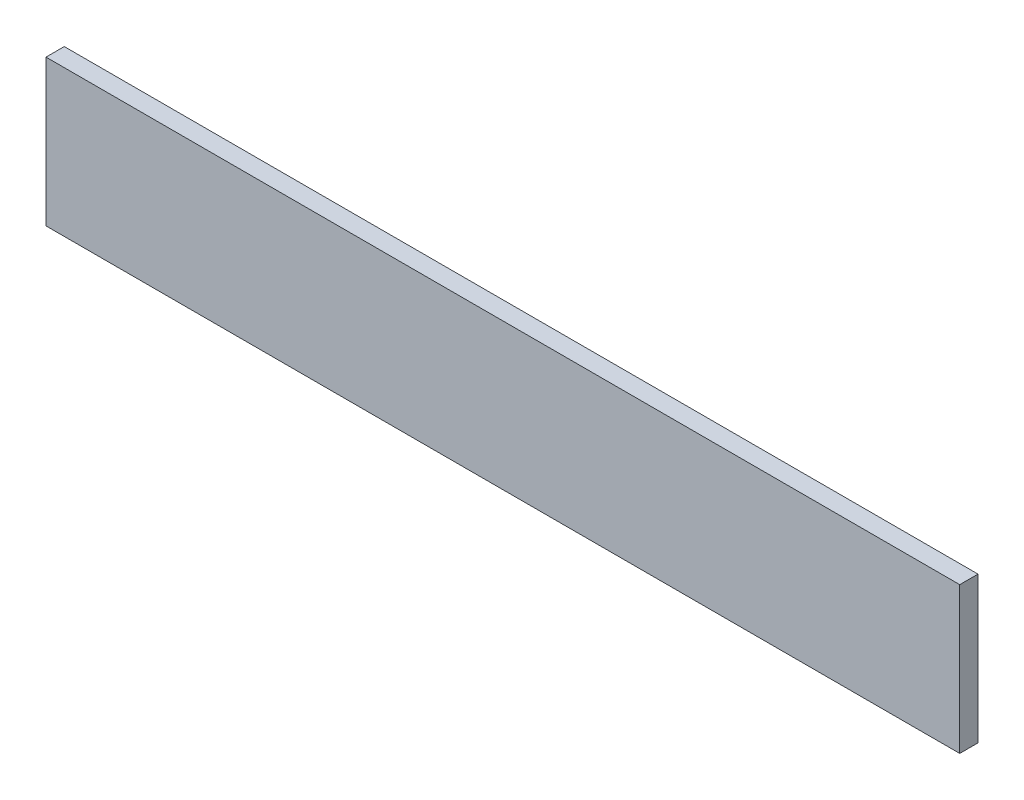
ISO-10303-21;
HEADER;
FILE_DESCRIPTION(('STEP AP214'),'2;1');
FILE_NAME('part.step','',(''),(''),'','','');
FILE_SCHEMA(('AUTOMOTIVE_DESIGN { 1 0 10303 214 1 1 1 1 }'));
ENDSEC;
DATA;
#1=APPLICATION_CONTEXT('core data for automotive mechanical design processes');
#2=APPLICATION_PROTOCOL_DEFINITION('international standard','automotive_design',2000,#1);
#3=PRODUCT_CONTEXT('',#1,'mechanical');
#4=PRODUCT('Part','Part','',(#3));
#5=PRODUCT_RELATED_PRODUCT_CATEGORY('part','',(#4));
#6=PRODUCT_DEFINITION_FORMATION('','',#4);
#7=PRODUCT_DEFINITION_CONTEXT('part definition',#1,'design');
#8=PRODUCT_DEFINITION('design','',#6,#7);
#9=PRODUCT_DEFINITION_SHAPE('','',#8);
#10=(LENGTH_UNIT() NAMED_UNIT(*) SI_UNIT(.MILLI.,.METRE.));
#11=(NAMED_UNIT(*) PLANE_ANGLE_UNIT() SI_UNIT($,.RADIAN.));
#12=(NAMED_UNIT(*) SI_UNIT($,.STERADIAN.) SOLID_ANGLE_UNIT());
#13=UNCERTAINTY_MEASURE_WITH_UNIT(LENGTH_MEASURE(1.E-05),#10,'distance_accuracy_value','');
#14=(GEOMETRIC_REPRESENTATION_CONTEXT(3) GLOBAL_UNCERTAINTY_ASSIGNED_CONTEXT((#13)) GLOBAL_UNIT_ASSIGNED_CONTEXT((#10,
#11,#12)) REPRESENTATION_CONTEXT('',''));
#15=CARTESIAN_POINT('',(0.,0.,0.));
#16=DIRECTION('',(0.,0.,1.));
#17=DIRECTION('',(1.,0.,0.));
#18=AXIS2_PLACEMENT_3D('',#15,#16,#17);
#19=CARTESIAN_POINT('',(125.,20.,5.));
#20=DIRECTION('',(-1.,0.,0.));
#21=DIRECTION('',(0.,0.,1.));
#22=AXIS2_PLACEMENT_3D('',#19,#20,#21);
#23=PLANE('',#22);
#24=DIRECTION('',(0.,1.,0.));
#25=VECTOR('',#24,1.);
#26=CARTESIAN_POINT('',(125.,20.,0.));
#27=LINE('',#26,#25);
#28=CARTESIAN_POINT('',(125.,-20.,0.));
#29=VERTEX_POINT('',#28);
#30=CARTESIAN_POINT('',(125.,20.,0.));
#31=VERTEX_POINT('',#30);
#32=EDGE_CURVE('E96',#29,#31,#27,.T.);
#33=ORIENTED_EDGE('',*,*,#32,.T.);
#34=DIRECTION('',(0.,0.,-1.));
#35=VECTOR('',#34,1.);
#36=CARTESIAN_POINT('',(125.,20.,5.));
#37=LINE('',#36,#35);
#38=CARTESIAN_POINT('',(125.,20.,5.));
#39=VERTEX_POINT('',#38);
#40=EDGE_CURVE('E11',#39,#31,#37,.T.);
#41=ORIENTED_EDGE('',*,*,#40,.F.);
#42=DIRECTION('',(0.,1.,0.));
#43=VECTOR('',#42,1.);
#44=CARTESIAN_POINT('',(125.,20.,5.));
#45=LINE('',#44,#43);
#46=CARTESIAN_POINT('',(125.,-20.,5.));
#47=VERTEX_POINT('',#46);
#48=EDGE_CURVE('E84',#47,#39,#45,.T.);
#49=ORIENTED_EDGE('',*,*,#48,.F.);
#50=DIRECTION('',(0.,0.,-1.));
#51=VECTOR('',#50,1.);
#52=CARTESIAN_POINT('',(125.,-20.,5.));
#53=LINE('',#52,#51);
#54=EDGE_CURVE('E92',#47,#29,#53,.T.);
#55=ORIENTED_EDGE('',*,*,#54,.T.);
#56=EDGE_LOOP('',(#33,#41,#49,#55));
#57=FACE_BOUND('',#56,.T.);
#58=ADVANCED_FACE('F33',(#57),#23,.F.);
#59=CARTESIAN_POINT('',(-125.,20.,5.));
#60=DIRECTION('',(0.,-1.,0.));
#61=DIRECTION('',(0.,0.,-1.));
#62=AXIS2_PLACEMENT_3D('',#59,#60,#61);
#63=PLANE('',#62);
#64=DIRECTION('',(-1.,0.,0.));
#65=VECTOR('',#64,1.);
#66=CARTESIAN_POINT('',(-125.,20.,0.));
#67=LINE('',#66,#65);
#68=CARTESIAN_POINT('',(-125.,20.,0.));
#69=VERTEX_POINT('',#68);
#70=EDGE_CURVE('E88',#31,#69,#67,.T.);
#71=ORIENTED_EDGE('',*,*,#70,.T.);
#72=DIRECTION('',(0.,0.,-1.));
#73=VECTOR('',#72,1.);
#74=CARTESIAN_POINT('',(-125.,20.,5.));
#75=LINE('',#74,#73);
#76=CARTESIAN_POINT('',(-125.,20.,5.));
#77=VERTEX_POINT('',#76);
#78=EDGE_CURVE('E41',#77,#69,#75,.T.);
#79=ORIENTED_EDGE('',*,*,#78,.F.);
#80=DIRECTION('',(-1.,0.,0.));
#81=VECTOR('',#80,1.);
#82=CARTESIAN_POINT('',(-125.,20.,5.));
#83=LINE('',#82,#81);
#84=EDGE_CURVE('E79',#39,#77,#83,.T.);
#85=ORIENTED_EDGE('',*,*,#84,.F.);
#86=ORIENTED_EDGE('',*,*,#40,.T.);
#87=EDGE_LOOP('',(#71,#79,#85,#86));
#88=FACE_BOUND('',#87,.T.);
#89=ADVANCED_FACE('F87',(#88),#63,.F.);
#90=CARTESIAN_POINT('',(-125.,20.,5.));
#91=DIRECTION('',(1.,0.,0.));
#92=DIRECTION('',(0.,0.,-1.));
#93=AXIS2_PLACEMENT_3D('',#90,#91,#92);
#94=PLANE('',#93);
#95=DIRECTION('',(0.,-1.,0.));
#96=VECTOR('',#95,1.);
#97=CARTESIAN_POINT('',(-125.,20.,0.));
#98=LINE('',#97,#96);
#99=CARTESIAN_POINT('',(-125.,-20.,0.));
#100=VERTEX_POINT('',#99);
#101=EDGE_CURVE('E66',#69,#100,#98,.T.);
#102=ORIENTED_EDGE('',*,*,#101,.T.);
#103=DIRECTION('',(0.,0.,-1.));
#104=VECTOR('',#103,1.);
#105=CARTESIAN_POINT('',(-125.,-20.,5.));
#106=LINE('',#105,#104);
#107=CARTESIAN_POINT('',(-125.,-20.,5.));
#108=VERTEX_POINT('',#107);
#109=EDGE_CURVE('E89',#108,#100,#106,.T.);
#110=ORIENTED_EDGE('',*,*,#109,.F.);
#111=DIRECTION('',(0.,-1.,0.));
#112=VECTOR('',#111,1.);
#113=CARTESIAN_POINT('',(-125.,20.,5.));
#114=LINE('',#113,#112);
#115=EDGE_CURVE('E82',#77,#108,#114,.T.);
#116=ORIENTED_EDGE('',*,*,#115,.F.);
#117=ORIENTED_EDGE('',*,*,#78,.T.);
#118=EDGE_LOOP('',(#102,#110,#116,#117));
#119=FACE_BOUND('',#118,.T.);
#120=ADVANCED_FACE('F90',(#119),#94,.F.);
#121=CARTESIAN_POINT('',(-125.,-20.,5.));
#122=DIRECTION('',(0.,1.,0.));
#123=DIRECTION('',(0.,0.,1.));
#124=AXIS2_PLACEMENT_3D('',#121,#122,#123);
#125=PLANE('',#124);
#126=DIRECTION('',(1.,0.,0.));
#127=VECTOR('',#126,1.);
#128=CARTESIAN_POINT('',(-125.,-20.,0.));
#129=LINE('',#128,#127);
#130=EDGE_CURVE('E72',#100,#29,#129,.T.);
#131=ORIENTED_EDGE('',*,*,#130,.T.);
#132=ORIENTED_EDGE('',*,*,#54,.F.);
#133=DIRECTION('',(1.,0.,0.));
#134=VECTOR('',#133,1.);
#135=CARTESIAN_POINT('',(-125.,-20.,5.));
#136=LINE('',#135,#134);
#137=EDGE_CURVE('E49',#108,#47,#136,.T.);
#138=ORIENTED_EDGE('',*,*,#137,.F.);
#139=ORIENTED_EDGE('',*,*,#109,.T.);
#140=EDGE_LOOP('',(#131,#132,#138,#139));
#141=FACE_BOUND('',#140,.T.);
#142=ADVANCED_FACE('F103',(#141),#125,.F.);
#143=CARTESIAN_POINT('',(0.,0.,5.));
#144=DIRECTION('',(0.,0.,1.));
#145=DIRECTION('',(1.,0.,0.));
#146=AXIS2_PLACEMENT_3D('',#143,#144,#145);
#147=PLANE('',#146);
#148=ORIENTED_EDGE('',*,*,#48,.T.);
#149=ORIENTED_EDGE('',*,*,#84,.T.);
#150=ORIENTED_EDGE('',*,*,#115,.T.);
#151=ORIENTED_EDGE('',*,*,#137,.T.);
#152=EDGE_LOOP('',(#148,#149,#150,#151));
#153=FACE_BOUND('',#152,.T.);
#154=ADVANCED_FACE('F80',(#153),#147,.T.);
#155=CARTESIAN_POINT('',(0.,0.,0.));
#156=DIRECTION('',(0.,0.,1.));
#157=DIRECTION('',(1.,0.,0.));
#158=AXIS2_PLACEMENT_3D('',#155,#156,#157);
#159=PLANE('',#158);
#160=ORIENTED_EDGE('',*,*,#32,.F.);
#161=ORIENTED_EDGE('',*,*,#130,.F.);
#162=ORIENTED_EDGE('',*,*,#101,.F.);
#163=ORIENTED_EDGE('',*,*,#70,.F.);
#164=EDGE_LOOP('',(#160,#161,#162,#163));
#165=FACE_BOUND('',#164,.T.);
#166=ADVANCED_FACE('F106',(#165),#159,.F.);
#167=CLOSED_SHELL('',(#58,#89,#120,#142,#154,#166));
#168=MANIFOLD_SOLID_BREP('B2',#167);
#169=ADVANCED_BREP_SHAPE_REPRESENTATION('',(#18,#168),#14);
#170=SHAPE_DEFINITION_REPRESENTATION(#9,#169);
ENDSEC;
END-ISO-10303-21;
